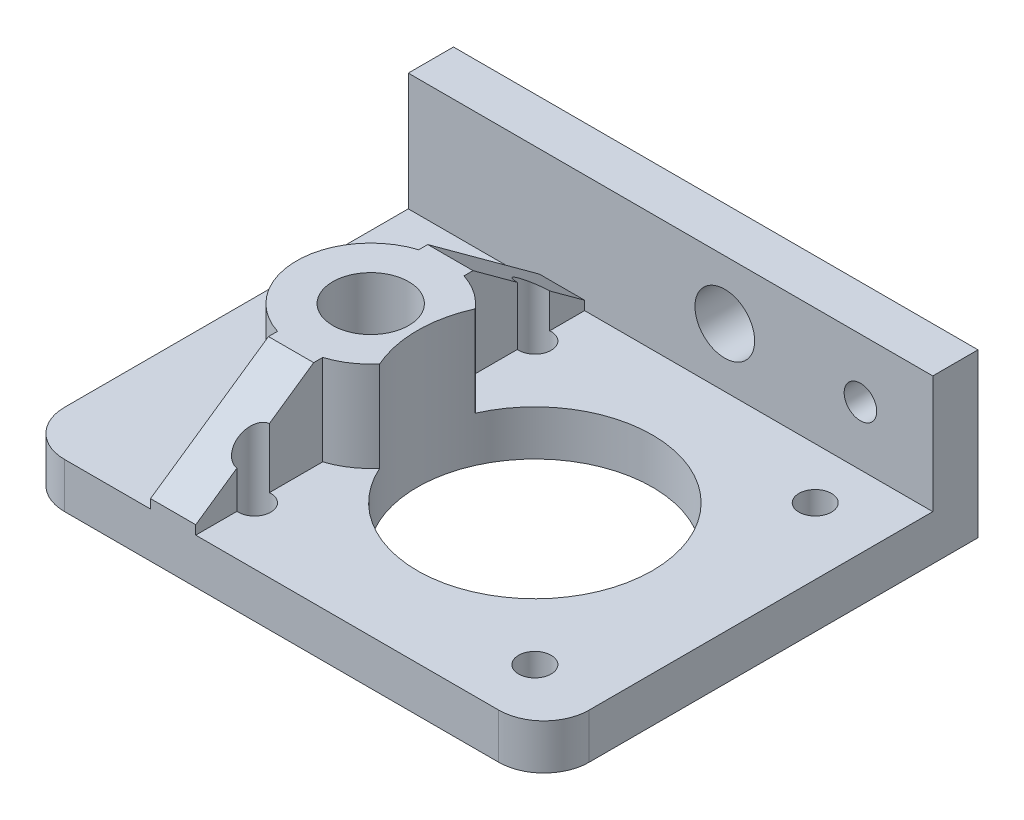
ISO-10303-21;
HEADER;
FILE_DESCRIPTION(('STEP AP214'),'2;1');
FILE_NAME('part.step','',(''),(''),'','','');
FILE_SCHEMA(('AUTOMOTIVE_DESIGN { 1 0 10303 214 1 1 1 1 }'));
ENDSEC;
DATA;
#1=APPLICATION_CONTEXT('core data for automotive mechanical design processes');
#2=APPLICATION_PROTOCOL_DEFINITION('international standard','automotive_design',2000,#1);
#3=PRODUCT_CONTEXT('',#1,'mechanical');
#4=PRODUCT('Part','Part','',(#3));
#5=PRODUCT_RELATED_PRODUCT_CATEGORY('part','',(#4));
#6=PRODUCT_DEFINITION_FORMATION('','',#4);
#7=PRODUCT_DEFINITION_CONTEXT('part definition',#1,'design');
#8=PRODUCT_DEFINITION('design','',#6,#7);
#9=PRODUCT_DEFINITION_SHAPE('','',#8);
#10=(LENGTH_UNIT() NAMED_UNIT(*) SI_UNIT(.MILLI.,.METRE.));
#11=(NAMED_UNIT(*) PLANE_ANGLE_UNIT() SI_UNIT($,.RADIAN.));
#12=(NAMED_UNIT(*) SI_UNIT($,.STERADIAN.) SOLID_ANGLE_UNIT());
#13=UNCERTAINTY_MEASURE_WITH_UNIT(LENGTH_MEASURE(1.E-05),#10,'distance_accuracy_value','');
#14=(GEOMETRIC_REPRESENTATION_CONTEXT(3) GLOBAL_UNCERTAINTY_ASSIGNED_CONTEXT((#13)) GLOBAL_UNIT_ASSIGNED_CONTEXT((#10,
#11,#12)) REPRESENTATION_CONTEXT('',''));
#15=CARTESIAN_POINT('',(0.,0.,0.));
#16=DIRECTION('',(0.,0.,1.));
#17=DIRECTION('',(1.,0.,0.));
#18=AXIS2_PLACEMENT_3D('',#15,#16,#17);
#19=CARTESIAN_POINT('',(0.,5.,0.));
#20=DIRECTION('',(0.,1.,0.));
#21=DIRECTION('',(0.,0.,1.));
#22=AXIS2_PLACEMENT_3D('',#19,#20,#21);
#23=PLANE('',#22);
#24=CARTESIAN_POINT('',(50.65,5.,10.65));
#25=DIRECTION('',(0.,1.,0.));
#26=DIRECTION('',(0.,0.,1.));
#27=AXIS2_PLACEMENT_3D('',#24,#25,#26);
#28=CIRCLE('',#27,1.8);
#29=CARTESIAN_POINT('',(50.65,5.,12.45));
#30=VERTEX_POINT('',#29);
#31=EDGE_CURVE('E335',#30,#30,#28,.T.);
#32=ORIENTED_EDGE('',*,*,#31,.F.);
#33=EDGE_LOOP('',(#32));
#34=FACE_BOUND('',#33,.T.);
#35=CARTESIAN_POINT('',(50.65,5.,41.65));
#36=DIRECTION('',(0.,1.,0.));
#37=DIRECTION('',(0.,0.,1.));
#38=AXIS2_PLACEMENT_3D('',#35,#36,#37);
#39=CIRCLE('',#38,1.8);
#40=CARTESIAN_POINT('',(50.65,5.,43.45));
#41=VERTEX_POINT('',#40);
#42=EDGE_CURVE('E338',#41,#41,#39,.T.);
#43=ORIENTED_EDGE('',*,*,#42,.F.);
#44=EDGE_LOOP('',(#43));
#45=FACE_BOUND('',#44,.T.);
#46=DIRECTION('',(0.,0.,1.));
#47=VECTOR('',#46,1.);
#48=CARTESIAN_POINT('',(58.,5.,0.));
#49=LINE('',#48,#47);
#50=CARTESIAN_POINT('',(58.,5.,5.));
#51=VERTEX_POINT('',#50);
#52=CARTESIAN_POINT('',(58.,5.,43.));
#53=VERTEX_POINT('',#52);
#54=EDGE_CURVE('E351',#51,#53,#49,.T.);
#55=ORIENTED_EDGE('',*,*,#54,.F.);
#56=DIRECTION('',(1.,0.,0.));
#57=VECTOR('',#56,1.);
#58=CARTESIAN_POINT('',(0.,5.,5.));
#59=LINE('',#58,#57);
#60=CARTESIAN_POINT('',(19.5,5.,5.));
#61=VERTEX_POINT('',#60);
#62=EDGE_CURVE('E226',#61,#51,#59,.T.);
#63=ORIENTED_EDGE('',*,*,#62,.F.);
#64=DIRECTION('',(0.,0.,1.));
#65=VECTOR('',#64,1.);
#66=CARTESIAN_POINT('',(19.5,5.,0.));
#67=LINE('',#66,#65);
#68=CARTESIAN_POINT('',(19.5,5.,8.8562608885348));
#69=VERTEX_POINT('',#68);
#70=EDGE_CURVE('E288',#61,#69,#67,.T.);
#71=ORIENTED_EDGE('',*,*,#70,.T.);
#72=CARTESIAN_POINT('',(19.65,5.,10.65));
#73=DIRECTION('',(0.,1.,0.));
#74=DIRECTION('',(0.,0.,1.));
#75=AXIS2_PLACEMENT_3D('',#72,#73,#74);
#76=CIRCLE('',#75,1.8);
#77=CARTESIAN_POINT('',(19.5,5.,12.4437391114652));
#78=VERTEX_POINT('',#77);
#79=EDGE_CURVE('E345',#78,#69,#76,.T.);
#80=ORIENTED_EDGE('',*,*,#79,.F.);
#81=CARTESIAN_POINT('',(19.5,5.,18.3403905347322));
#82=VERTEX_POINT('',#81);
#83=EDGE_CURVE('E285',#78,#82,#67,.T.);
#84=ORIENTED_EDGE('',*,*,#83,.T.);
#85=CARTESIAN_POINT('',(17.,5.,26.15));
#86=DIRECTION('',(0.,1.,0.));
#87=DIRECTION('',(0.,0.,1.));
#88=AXIS2_PLACEMENT_3D('',#85,#86,#87);
#89=CIRCLE('',#88,8.20000000000001);
#90=CARTESIAN_POINT('',(23.271694214876,5.,20.8674010491908));
#91=VERTEX_POINT('',#90);
#92=EDGE_CURVE('E314',#91,#82,#89,.T.);
#93=ORIENTED_EDGE('',*,*,#92,.F.);
#94=CARTESIAN_POINT('',(35.15,5.,26.15));
#95=DIRECTION('',(0.,1.,0.));
#96=DIRECTION('',(0.,0.,1.));
#97=AXIS2_PLACEMENT_3D('',#94,#95,#96);
#98=CIRCLE('',#97,13.);
#99=CARTESIAN_POINT('',(23.271694214876,5.,31.4325989508092));
#100=VERTEX_POINT('',#99);
#101=EDGE_CURVE('E348',#100,#91,#98,.T.);
#102=ORIENTED_EDGE('',*,*,#101,.F.);
#103=CARTESIAN_POINT('',(19.5,5.,33.9596094652678));
#104=VERTEX_POINT('',#103);
#105=EDGE_CURVE('E325',#104,#100,#89,.T.);
#106=ORIENTED_EDGE('',*,*,#105,.F.);
#107=DIRECTION('',(0.,0.,-1.));
#108=VECTOR('',#107,1.);
#109=CARTESIAN_POINT('',(19.5,5.,0.));
#110=LINE('',#109,#108);
#111=CARTESIAN_POINT('',(19.5,5.,39.8562608885348));
#112=VERTEX_POINT('',#111);
#113=EDGE_CURVE('E261',#112,#104,#110,.T.);
#114=ORIENTED_EDGE('',*,*,#113,.F.);
#115=CARTESIAN_POINT('',(19.65,5.,41.65));
#116=DIRECTION('',(0.,1.,0.));
#117=DIRECTION('',(0.,0.,1.));
#118=AXIS2_PLACEMENT_3D('',#115,#116,#117);
#119=CIRCLE('',#118,1.8);
#120=CARTESIAN_POINT('',(19.5,5.,43.4437391114652));
#121=VERTEX_POINT('',#120);
#122=EDGE_CURVE('E342',#121,#112,#119,.T.);
#123=ORIENTED_EDGE('',*,*,#122,.F.);
#124=DIRECTION('',(0.,0.,-1.));
#125=VECTOR('',#124,1.);
#126=CARTESIAN_POINT('',(19.5,5.,0.));
#127=LINE('',#126,#125);
#128=CARTESIAN_POINT('',(19.5,5.,48.));
#129=VERTEX_POINT('',#128);
#130=EDGE_CURVE('E266',#129,#121,#127,.T.);
#131=ORIENTED_EDGE('',*,*,#130,.F.);
#132=DIRECTION('',(1.,0.,0.));
#133=VECTOR('',#132,1.);
#134=CARTESIAN_POINT('',(0.,5.,48.));
#135=LINE('',#134,#133);
#136=CARTESIAN_POINT('',(53.,5.,48.));
#137=VERTEX_POINT('',#136);
#138=EDGE_CURVE('E355',#129,#137,#135,.T.);
#139=ORIENTED_EDGE('',*,*,#138,.T.);
#140=CARTESIAN_POINT('',(53.,5.,43.));
#141=DIRECTION('',(0.,1.,0.));
#142=DIRECTION('',(0.,0.,1.));
#143=AXIS2_PLACEMENT_3D('',#140,#141,#142);
#144=CIRCLE('',#143,5.);
#145=EDGE_CURVE('E396',#137,#53,#144,.T.);
#146=ORIENTED_EDGE('',*,*,#145,.T.);
#147=EDGE_LOOP('',(#55,#63,#71,#80,#84,#93,#102,#106,#114,#123,#131,#139,#146));
#148=FACE_BOUND('',#147,.T.);
#149=ADVANCED_FACE('F37',(#34,#45,#148),#23,.T.);
#150=DIRECTION('',(0.,0.,1.));
#151=VECTOR('',#150,1.);
#152=CARTESIAN_POINT('',(14.5,5.,0.));
#153=LINE('',#152,#151);
#154=CARTESIAN_POINT('',(14.5,5.,5.));
#155=VERTEX_POINT('',#154);
#156=CARTESIAN_POINT('',(14.5,5.,18.3403905347322));
#157=VERTEX_POINT('',#156);
#158=EDGE_CURVE('E289',#155,#157,#153,.T.);
#159=ORIENTED_EDGE('',*,*,#158,.F.);
#160=CARTESIAN_POINT('',(0.,5.,5.));
#161=VERTEX_POINT('',#160);
#162=EDGE_CURVE('E224',#161,#155,#59,.T.);
#163=ORIENTED_EDGE('',*,*,#162,.F.);
#164=DIRECTION('',(0.,0.,1.));
#165=VECTOR('',#164,1.);
#166=CARTESIAN_POINT('',(0.,5.,0.));
#167=LINE('',#166,#165);
#168=CARTESIAN_POINT('',(0.,5.,43.));
#169=VERTEX_POINT('',#168);
#170=EDGE_CURVE('E353',#161,#169,#167,.T.);
#171=ORIENTED_EDGE('',*,*,#170,.T.);
#172=CARTESIAN_POINT('',(5.00000000000001,5.,43.));
#173=DIRECTION('',(0.,1.,0.));
#174=DIRECTION('',(0.,0.,1.));
#175=AXIS2_PLACEMENT_3D('',#172,#173,#174);
#176=CIRCLE('',#175,5.);
#177=CARTESIAN_POINT('',(5.00000000000001,5.,48.));
#178=VERTEX_POINT('',#177);
#179=EDGE_CURVE('E394',#169,#178,#176,.T.);
#180=ORIENTED_EDGE('',*,*,#179,.T.);
#181=CARTESIAN_POINT('',(14.5,5.,48.));
#182=VERTEX_POINT('',#181);
#183=EDGE_CURVE('E209',#178,#182,#135,.T.);
#184=ORIENTED_EDGE('',*,*,#183,.T.);
#185=DIRECTION('',(0.,0.,-1.));
#186=VECTOR('',#185,1.);
#187=CARTESIAN_POINT('',(14.5,5.,0.));
#188=LINE('',#187,#186);
#189=CARTESIAN_POINT('',(14.5,5.,33.9596094652678));
#190=VERTEX_POINT('',#189);
#191=EDGE_CURVE('E269',#182,#190,#188,.T.);
#192=ORIENTED_EDGE('',*,*,#191,.T.);
#193=EDGE_CURVE('E328',#157,#190,#89,.T.);
#194=ORIENTED_EDGE('',*,*,#193,.F.);
#195=EDGE_LOOP('',(#159,#163,#171,#180,#184,#192,#194));
#196=FACE_BOUND('',#195,.T.);
#197=ADVANCED_FACE('F483',(#196),#23,.T.);
#198=CARTESIAN_POINT('',(17.,15.,26.15));
#199=DIRECTION('',(0.,-1.,0.));
#200=DIRECTION('',(0.,0.,-1.));
#201=AXIS2_PLACEMENT_3D('',#198,#199,#200);
#202=CYLINDRICAL_SURFACE('',#201,8.20000000000001);
#203=DIRECTION('',(0.,-1.,0.));
#204=VECTOR('',#203,1.);
#205=CARTESIAN_POINT('',(19.5,15.,33.9596094652678));
#206=LINE('',#205,#204);
#207=CARTESIAN_POINT('',(19.5,15.,33.9596094652678));
#208=VERTEX_POINT('',#207);
#209=EDGE_CURVE('E281',#104,#208,#206,.F.);
#210=ORIENTED_EDGE('',*,*,#209,.F.);
#211=ORIENTED_EDGE('',*,*,#105,.T.);
#212=DIRECTION('',(0.,-1.,0.));
#213=VECTOR('',#212,1.);
#214=CARTESIAN_POINT('',(23.271694214876,15.,31.4325989508092));
#215=LINE('',#214,#213);
#216=CARTESIAN_POINT('',(23.271694214876,15.,31.4325989508092));
#217=VERTEX_POINT('',#216);
#218=EDGE_CURVE('E321',#217,#100,#215,.T.);
#219=ORIENTED_EDGE('',*,*,#218,.F.);
#220=CARTESIAN_POINT('',(17.,15.,26.15));
#221=DIRECTION('',(0.,1.,0.));
#222=DIRECTION('',(0.,0.,1.));
#223=AXIS2_PLACEMENT_3D('',#220,#221,#222);
#224=CIRCLE('',#223,8.20000000000001);
#225=EDGE_CURVE('E317',#208,#217,#224,.T.);
#226=ORIENTED_EDGE('',*,*,#225,.F.);
#227=EDGE_LOOP('',(#210,#211,#219,#226));
#228=FACE_BOUND('',#227,.T.);
#229=ADVANCED_FACE('F431',(#228),#202,.T.);
#230=ORIENTED_EDGE('',*,*,#193,.T.);
#231=DIRECTION('',(0.,-1.,0.));
#232=VECTOR('',#231,1.);
#233=CARTESIAN_POINT('',(14.5,15.,33.9596094652678));
#234=LINE('',#233,#232);
#235=CARTESIAN_POINT('',(14.5,15.,33.9596094652678));
#236=VERTEX_POINT('',#235);
#237=EDGE_CURVE('E273',#190,#236,#234,.F.);
#238=ORIENTED_EDGE('',*,*,#237,.T.);
#239=CARTESIAN_POINT('',(14.5,15.,18.3403905347322));
#240=VERTEX_POINT('',#239);
#241=EDGE_CURVE('E322',#240,#236,#224,.T.);
#242=ORIENTED_EDGE('',*,*,#241,.F.);
#243=DIRECTION('',(0.,-1.,0.));
#244=VECTOR('',#243,1.);
#245=CARTESIAN_POINT('',(14.5,15.,18.3403905347322));
#246=LINE('',#245,#244);
#247=EDGE_CURVE('E303',#157,#240,#246,.F.);
#248=ORIENTED_EDGE('',*,*,#247,.F.);
#249=EDGE_LOOP('',(#230,#238,#242,#248));
#250=FACE_BOUND('',#249,.T.);
#251=ADVANCED_FACE('F422',(#250),#202,.T.);
#252=CARTESIAN_POINT('',(58.,5.,0.));
#253=DIRECTION('',(1.,0.,0.));
#254=DIRECTION('',(0.,0.,-1.));
#255=AXIS2_PLACEMENT_3D('',#252,#253,#254);
#256=PLANE('',#255);
#257=DIRECTION('',(0.,-1.,0.));
#258=VECTOR('',#257,1.);
#259=CARTESIAN_POINT('',(58.,5.,0.));
#260=LINE('',#259,#258);
#261=CARTESIAN_POINT('',(58.,18.,0.));
#262=VERTEX_POINT('',#261);
#263=CARTESIAN_POINT('',(58.,0.,0.));
#264=VERTEX_POINT('',#263);
#265=EDGE_CURVE('E208',#262,#264,#260,.T.);
#266=ORIENTED_EDGE('',*,*,#265,.F.);
#267=DIRECTION('',(0.,0.,-1.));
#268=VECTOR('',#267,1.);
#269=CARTESIAN_POINT('',(58.,18.,0.));
#270=LINE('',#269,#268);
#271=CARTESIAN_POINT('',(58.,18.,5.));
#272=VERTEX_POINT('',#271);
#273=EDGE_CURVE('E223',#272,#262,#270,.T.);
#274=ORIENTED_EDGE('',*,*,#273,.F.);
#275=DIRECTION('',(0.,-1.,0.));
#276=VECTOR('',#275,1.);
#277=CARTESIAN_POINT('',(58.,18.,5.));
#278=LINE('',#277,#276);
#279=EDGE_CURVE('E233',#272,#51,#278,.T.);
#280=ORIENTED_EDGE('',*,*,#279,.T.);
#281=ORIENTED_EDGE('',*,*,#54,.T.);
#282=DIRECTION('',(0.,-1.,0.));
#283=VECTOR('',#282,1.);
#284=CARTESIAN_POINT('',(58.,0.,43.));
#285=LINE('',#284,#283);
#286=CARTESIAN_POINT('',(58.,0.,43.));
#287=VERTEX_POINT('',#286);
#288=EDGE_CURVE('E381',#53,#287,#285,.T.);
#289=ORIENTED_EDGE('',*,*,#288,.T.);
#290=DIRECTION('',(0.,0.,1.));
#291=VECTOR('',#290,1.);
#292=CARTESIAN_POINT('',(58.,0.,0.));
#293=LINE('',#292,#291);
#294=EDGE_CURVE('E372',#264,#287,#293,.T.);
#295=ORIENTED_EDGE('',*,*,#294,.F.);
#296=EDGE_LOOP('',(#266,#274,#280,#281,#289,#295));
#297=FACE_BOUND('',#296,.T.);
#298=ADVANCED_FACE('F516',(#297),#256,.T.);
#299=CARTESIAN_POINT('',(0.,5.,0.));
#300=DIRECTION('',(0.,0.,-1.));
#301=DIRECTION('',(-1.,0.,0.));
#302=AXIS2_PLACEMENT_3D('',#299,#300,#301);
#303=PLANE('',#302);
#304=CARTESIAN_POINT('',(35.,11.5,0.));
#305=DIRECTION('',(0.,0.,-1.));
#306=DIRECTION('',(-1.,0.,0.));
#307=AXIS2_PLACEMENT_3D('',#304,#305,#306);
#308=CIRCLE('',#307,3.3);
#309=CARTESIAN_POINT('',(31.7,11.5,0.));
#310=VERTEX_POINT('',#309);
#311=EDGE_CURVE('E464',#310,#310,#308,.T.);
#312=ORIENTED_EDGE('',*,*,#311,.F.);
#313=EDGE_LOOP('',(#312));
#314=FACE_BOUND('',#313,.T.);
#315=CARTESIAN_POINT('',(50.,11.5,0.));
#316=DIRECTION('',(0.,0.,-1.));
#317=DIRECTION('',(-1.,0.,0.));
#318=AXIS2_PLACEMENT_3D('',#315,#316,#317);
#319=CIRCLE('',#318,1.79999999999999);
#320=CARTESIAN_POINT('',(48.2,11.5,0.));
#321=VERTEX_POINT('',#320);
#322=EDGE_CURVE('E229',#321,#321,#319,.T.);
#323=ORIENTED_EDGE('',*,*,#322,.F.);
#324=EDGE_LOOP('',(#323));
#325=FACE_BOUND('',#324,.T.);
#326=DIRECTION('',(1.,0.,0.));
#327=VECTOR('',#326,1.);
#328=CARTESIAN_POINT('',(0.,0.,0.));
#329=LINE('',#328,#327);
#330=CARTESIAN_POINT('',(0.,0.,0.));
#331=VERTEX_POINT('',#330);
#332=EDGE_CURVE('E204',#331,#264,#329,.T.);
#333=ORIENTED_EDGE('',*,*,#332,.F.);
#334=DIRECTION('',(0.,-1.,0.));
#335=VECTOR('',#334,1.);
#336=CARTESIAN_POINT('',(0.,5.,0.));
#337=LINE('',#336,#335);
#338=CARTESIAN_POINT('',(0.,18.,0.));
#339=VERTEX_POINT('',#338);
#340=EDGE_CURVE('E198',#339,#331,#337,.T.);
#341=ORIENTED_EDGE('',*,*,#340,.F.);
#342=DIRECTION('',(-1.,0.,0.));
#343=VECTOR('',#342,1.);
#344=CARTESIAN_POINT('',(0.,18.,0.));
#345=LINE('',#344,#343);
#346=EDGE_CURVE('E202',#262,#339,#345,.T.);
#347=ORIENTED_EDGE('',*,*,#346,.F.);
#348=ORIENTED_EDGE('',*,*,#265,.T.);
#349=EDGE_LOOP('',(#333,#341,#347,#348));
#350=FACE_BOUND('',#349,.T.);
#351=ADVANCED_FACE('F200',(#314,#325,#350),#303,.T.);
#352=CARTESIAN_POINT('',(0.,5.,0.));
#353=DIRECTION('',(1.,0.,0.));
#354=DIRECTION('',(0.,0.,-1.));
#355=AXIS2_PLACEMENT_3D('',#352,#353,#354);
#356=PLANE('',#355);
#357=DIRECTION('',(0.,0.,1.));
#358=VECTOR('',#357,1.);
#359=CARTESIAN_POINT('',(0.,0.,0.));
#360=LINE('',#359,#358);
#361=CARTESIAN_POINT('',(0.,0.,43.));
#362=VERTEX_POINT('',#361);
#363=EDGE_CURVE('E376',#331,#362,#360,.T.);
#364=ORIENTED_EDGE('',*,*,#363,.T.);
#365=DIRECTION('',(0.,-1.,0.));
#366=VECTOR('',#365,1.);
#367=CARTESIAN_POINT('',(0.,5.,43.));
#368=LINE('',#367,#366);
#369=EDGE_CURVE('E399',#362,#169,#368,.F.);
#370=ORIENTED_EDGE('',*,*,#369,.T.);
#371=ORIENTED_EDGE('',*,*,#170,.F.);
#372=DIRECTION('',(0.,-1.,0.));
#373=VECTOR('',#372,1.);
#374=CARTESIAN_POINT('',(0.,18.,5.));
#375=LINE('',#374,#373);
#376=CARTESIAN_POINT('',(0.,18.,5.));
#377=VERTEX_POINT('',#376);
#378=EDGE_CURVE('E215',#377,#161,#375,.T.);
#379=ORIENTED_EDGE('',*,*,#378,.F.);
#380=DIRECTION('',(0.,0.,1.));
#381=VECTOR('',#380,1.);
#382=CARTESIAN_POINT('',(0.,18.,0.));
#383=LINE('',#382,#381);
#384=EDGE_CURVE('E212',#339,#377,#383,.T.);
#385=ORIENTED_EDGE('',*,*,#384,.F.);
#386=ORIENTED_EDGE('',*,*,#340,.T.);
#387=EDGE_LOOP('',(#364,#370,#371,#379,#385,#386));
#388=FACE_BOUND('',#387,.T.);
#389=ADVANCED_FACE('F213',(#388),#356,.F.);
#390=CARTESIAN_POINT('',(35.15,5.,26.15));
#391=DIRECTION('',(0.,-1.,0.));
#392=DIRECTION('',(0.,0.,-1.));
#393=AXIS2_PLACEMENT_3D('',#390,#391,#392);
#394=CYLINDRICAL_SURFACE('',#393,13.);
#395=ORIENTED_EDGE('',*,*,#101,.T.);
#396=DIRECTION('',(0.,-1.,0.));
#397=VECTOR('',#396,1.);
#398=CARTESIAN_POINT('',(23.271694214876,15.,20.8674010491908));
#399=LINE('',#398,#397);
#400=CARTESIAN_POINT('',(23.271694214876,15.,20.8674010491908));
#401=VERTEX_POINT('',#400);
#402=EDGE_CURVE('E331',#401,#91,#399,.T.);
#403=ORIENTED_EDGE('',*,*,#402,.F.);
#404=CARTESIAN_POINT('',(35.15,15.,26.15));
#405=DIRECTION('',(0.,1.,0.));
#406=DIRECTION('',(0.,0.,1.));
#407=AXIS2_PLACEMENT_3D('',#404,#405,#406);
#408=CIRCLE('',#407,13.);
#409=EDGE_CURVE('E313',#217,#401,#408,.F.);
#410=ORIENTED_EDGE('',*,*,#409,.F.);
#411=ORIENTED_EDGE('',*,*,#218,.T.);
#412=EDGE_LOOP('',(#395,#403,#410,#411));
#413=FACE_BOUND('',#412,.T.);
#414=CARTESIAN_POINT('',(35.15,0.,26.15));
#415=DIRECTION('',(0.,1.,0.));
#416=DIRECTION('',(0.,0.,1.));
#417=AXIS2_PLACEMENT_3D('',#414,#415,#416);
#418=CIRCLE('',#417,13.);
#419=CARTESIAN_POINT('',(35.15,0.,39.15));
#420=VERTEX_POINT('',#419);
#421=EDGE_CURVE('E369',#420,#420,#418,.T.);
#422=ORIENTED_EDGE('',*,*,#421,.F.);
#423=EDGE_LOOP('',(#422));
#424=FACE_BOUND('',#423,.T.);
#425=ADVANCED_FACE('F435',(#413,#424),#394,.F.);
#426=CARTESIAN_POINT('',(19.65,5.,10.65));
#427=DIRECTION('',(0.,-1.,0.));
#428=DIRECTION('',(0.,0.,-1.));
#429=AXIS2_PLACEMENT_3D('',#426,#427,#428);
#430=CYLINDRICAL_SURFACE('',#429,1.8);
#431=CARTESIAN_POINT('',(19.65,10.1206151342522,10.65));
#432=DIRECTION('',(0.,-0.807951468125277,0.58924903492005));
#433=DIRECTION('',(0.,-0.58924903492005,-0.807951468125277));
#434=AXIS2_PLACEMENT_3D('',#431,#432,#433);
#435=ELLIPSE('',#434,2.22785658670392,1.8);
#436=CARTESIAN_POINT('',(19.5,11.428811334182,12.4437391114652));
#437=VERTEX_POINT('',#436);
#438=CARTESIAN_POINT('',(19.5,8.81241893432235,8.8562608885348));
#439=VERTEX_POINT('',#438);
#440=EDGE_CURVE('E256',#437,#439,#435,.T.);
#441=ORIENTED_EDGE('',*,*,#440,.F.);
#442=DIRECTION('',(0.,-1.,0.));
#443=VECTOR('',#442,1.);
#444=CARTESIAN_POINT('',(19.5,31.6199428398536,12.4437391114652));
#445=LINE('',#444,#443);
#446=EDGE_CURVE('E297',#437,#78,#445,.T.);
#447=ORIENTED_EDGE('',*,*,#446,.T.);
#448=ORIENTED_EDGE('',*,*,#79,.T.);
#449=DIRECTION('',(0.,-1.,0.));
#450=VECTOR('',#449,1.);
#451=CARTESIAN_POINT('',(19.5,31.6199428398536,8.8562608885348));
#452=LINE('',#451,#450);
#453=EDGE_CURVE('E287',#439,#69,#452,.T.);
#454=ORIENTED_EDGE('',*,*,#453,.F.);
#455=EDGE_LOOP('',(#441,#447,#448,#454));
#456=FACE_BOUND('',#455,.T.);
#457=CARTESIAN_POINT('',(19.65,0.,10.65));
#458=DIRECTION('',(0.,1.,0.));
#459=DIRECTION('',(0.,0.,1.));
#460=AXIS2_PLACEMENT_3D('',#457,#458,#459);
#461=CIRCLE('',#460,1.8);
#462=CARTESIAN_POINT('',(19.65,0.,12.45));
#463=VERTEX_POINT('',#462);
#464=EDGE_CURVE('E366',#463,#463,#461,.T.);
#465=ORIENTED_EDGE('',*,*,#464,.F.);
#466=EDGE_LOOP('',(#465));
#467=FACE_BOUND('',#466,.T.);
#468=ADVANCED_FACE('F448',(#456,#467),#430,.F.);
#469=CARTESIAN_POINT('',(19.65,5.,41.65));
#470=DIRECTION('',(0.,-1.,0.));
#471=DIRECTION('',(0.,0.,-1.));
#472=AXIS2_PLACEMENT_3D('',#469,#470,#471);
#473=CYLINDRICAL_SURFACE('',#472,1.8);
#474=CARTESIAN_POINT('',(19.65,10.3825374591186,41.65));
#475=DIRECTION('',(0.,-0.823017255566813,-0.568016370397255));
#476=DIRECTION('',(0.,-0.568016370397255,0.823017255566813));
#477=AXIS2_PLACEMENT_3D('',#474,#475,#476);
#478=ELLIPSE('',#477,2.18707443595498,1.8);
#479=CARTESIAN_POINT('',(19.5,9.14456441220801,43.4437391114652));
#480=VERTEX_POINT('',#479);
#481=CARTESIAN_POINT('',(19.5,11.6205105060292,39.8562608885348));
#482=VERTEX_POINT('',#481);
#483=EDGE_CURVE('E242',#480,#482,#478,.T.);
#484=ORIENTED_EDGE('',*,*,#483,.F.);
#485=DIRECTION('',(0.,-1.,0.));
#486=VECTOR('',#485,1.);
#487=CARTESIAN_POINT('',(19.5,31.6199428398536,43.4437391114652));
#488=LINE('',#487,#486);
#489=EDGE_CURVE('E264',#480,#121,#488,.T.);
#490=ORIENTED_EDGE('',*,*,#489,.T.);
#491=ORIENTED_EDGE('',*,*,#122,.T.);
#492=DIRECTION('',(0.,-1.,0.));
#493=VECTOR('',#492,1.);
#494=CARTESIAN_POINT('',(19.5,31.6199428398536,39.8562608885348));
#495=LINE('',#494,#493);
#496=EDGE_CURVE('E265',#482,#112,#495,.T.);
#497=ORIENTED_EDGE('',*,*,#496,.F.);
#498=EDGE_LOOP('',(#484,#490,#491,#497));
#499=FACE_BOUND('',#498,.T.);
#500=CARTESIAN_POINT('',(19.65,0.,41.65));
#501=DIRECTION('',(0.,1.,0.));
#502=DIRECTION('',(0.,0.,1.));
#503=AXIS2_PLACEMENT_3D('',#500,#501,#502);
#504=CIRCLE('',#503,1.8);
#505=CARTESIAN_POINT('',(19.65,0.,43.45));
#506=VERTEX_POINT('',#505);
#507=EDGE_CURVE('E363',#506,#506,#504,.T.);
#508=ORIENTED_EDGE('',*,*,#507,.F.);
#509=EDGE_LOOP('',(#508));
#510=FACE_BOUND('',#509,.T.);
#511=ADVANCED_FACE('F504',(#499,#510),#473,.F.);
#512=CARTESIAN_POINT('',(50.65,5.,41.65));
#513=DIRECTION('',(0.,-1.,0.));
#514=DIRECTION('',(0.,0.,-1.));
#515=AXIS2_PLACEMENT_3D('',#512,#513,#514);
#516=CYLINDRICAL_SURFACE('',#515,1.8);
#517=ORIENTED_EDGE('',*,*,#42,.T.);
#518=EDGE_LOOP('',(#517));
#519=FACE_BOUND('',#518,.T.);
#520=CARTESIAN_POINT('',(50.65,0.,41.65));
#521=DIRECTION('',(0.,1.,0.));
#522=DIRECTION('',(0.,0.,1.));
#523=AXIS2_PLACEMENT_3D('',#520,#521,#522);
#524=CIRCLE('',#523,1.8);
#525=CARTESIAN_POINT('',(50.65,0.,43.45));
#526=VERTEX_POINT('',#525);
#527=EDGE_CURVE('E360',#526,#526,#524,.T.);
#528=ORIENTED_EDGE('',*,*,#527,.F.);
#529=EDGE_LOOP('',(#528));
#530=FACE_BOUND('',#529,.T.);
#531=ADVANCED_FACE('F596',(#519,#530),#516,.F.);
#532=CARTESIAN_POINT('',(50.65,5.,10.65));
#533=DIRECTION('',(0.,-1.,0.));
#534=DIRECTION('',(0.,0.,-1.));
#535=AXIS2_PLACEMENT_3D('',#532,#533,#534);
#536=CYLINDRICAL_SURFACE('',#535,1.8);
#537=ORIENTED_EDGE('',*,*,#31,.T.);
#538=EDGE_LOOP('',(#537));
#539=FACE_BOUND('',#538,.T.);
#540=CARTESIAN_POINT('',(50.65,0.,10.65));
#541=DIRECTION('',(0.,1.,0.));
#542=DIRECTION('',(0.,0.,1.));
#543=AXIS2_PLACEMENT_3D('',#540,#541,#542);
#544=CIRCLE('',#543,1.8);
#545=CARTESIAN_POINT('',(50.65,0.,12.45));
#546=VERTEX_POINT('',#545);
#547=EDGE_CURVE('E334',#546,#546,#544,.T.);
#548=ORIENTED_EDGE('',*,*,#547,.F.);
#549=EDGE_LOOP('',(#548));
#550=FACE_BOUND('',#549,.T.);
#551=ADVANCED_FACE('F529',(#539,#550),#536,.F.);
#552=CARTESIAN_POINT('',(0.,5.,48.));
#553=DIRECTION('',(0.,0.,-1.));
#554=DIRECTION('',(-1.,0.,0.));
#555=AXIS2_PLACEMENT_3D('',#552,#553,#554);
#556=PLANE('',#555);
#557=DIRECTION('',(0.,-1.,0.));
#558=VECTOR('',#557,1.);
#559=CARTESIAN_POINT('',(19.5,31.6199428398536,48.));
#560=LINE('',#559,#558);
#561=CARTESIAN_POINT('',(19.5,6.,48.));
#562=VERTEX_POINT('',#561);
#563=EDGE_CURVE('E58',#562,#129,#560,.T.);
#564=ORIENTED_EDGE('',*,*,#563,.F.);
#565=DIRECTION('',(-1.,0.,0.));
#566=VECTOR('',#565,1.);
#567=CARTESIAN_POINT('',(58.,6.,48.));
#568=LINE('',#567,#566);
#569=CARTESIAN_POINT('',(14.5,6.,48.));
#570=VERTEX_POINT('',#569);
#571=EDGE_CURVE('E52',#562,#570,#568,.T.);
#572=ORIENTED_EDGE('',*,*,#571,.T.);
#573=DIRECTION('',(0.,-1.,0.));
#574=VECTOR('',#573,1.);
#575=CARTESIAN_POINT('',(14.5,31.6199428398536,48.));
#576=LINE('',#575,#574);
#577=EDGE_CURVE('E268',#570,#182,#576,.T.);
#578=ORIENTED_EDGE('',*,*,#577,.T.);
#579=ORIENTED_EDGE('',*,*,#183,.F.);
#580=DIRECTION('',(0.,-1.,0.));
#581=VECTOR('',#580,1.);
#582=CARTESIAN_POINT('',(5.00000000000001,5.,48.));
#583=LINE('',#582,#581);
#584=CARTESIAN_POINT('',(5.00000000000001,0.,48.));
#585=VERTEX_POINT('',#584);
#586=EDGE_CURVE('E388',#178,#585,#583,.T.);
#587=ORIENTED_EDGE('',*,*,#586,.T.);
#588=DIRECTION('',(1.,0.,0.));
#589=VECTOR('',#588,1.);
#590=CARTESIAN_POINT('',(0.,0.,48.));
#591=LINE('',#590,#589);
#592=CARTESIAN_POINT('',(53.,0.,48.));
#593=VERTEX_POINT('',#592);
#594=EDGE_CURVE('E339',#585,#593,#591,.T.);
#595=ORIENTED_EDGE('',*,*,#594,.T.);
#596=DIRECTION('',(0.,-1.,0.));
#597=VECTOR('',#596,1.);
#598=CARTESIAN_POINT('',(53.,5.,48.));
#599=LINE('',#598,#597);
#600=EDGE_CURVE('E391',#593,#137,#599,.F.);
#601=ORIENTED_EDGE('',*,*,#600,.T.);
#602=ORIENTED_EDGE('',*,*,#138,.F.);
#603=EDGE_LOOP('',(#564,#572,#578,#579,#587,#595,#601,#602));
#604=FACE_BOUND('',#603,.T.);
#605=ADVANCED_FACE('F491',(#604),#556,.F.);
#606=CARTESIAN_POINT('',(0.,0.,0.));
#607=DIRECTION('',(0.,1.,0.));
#608=DIRECTION('',(0.,0.,1.));
#609=AXIS2_PLACEMENT_3D('',#606,#607,#608);
#610=PLANE('',#609);
#611=ORIENTED_EDGE('',*,*,#547,.T.);
#612=EDGE_LOOP('',(#611));
#613=FACE_BOUND('',#612,.T.);
#614=ORIENTED_EDGE('',*,*,#527,.T.);
#615=EDGE_LOOP('',(#614));
#616=FACE_BOUND('',#615,.T.);
#617=ORIENTED_EDGE('',*,*,#507,.T.);
#618=EDGE_LOOP('',(#617));
#619=FACE_BOUND('',#618,.T.);
#620=ORIENTED_EDGE('',*,*,#464,.T.);
#621=EDGE_LOOP('',(#620));
#622=FACE_BOUND('',#621,.T.);
#623=ORIENTED_EDGE('',*,*,#421,.T.);
#624=EDGE_LOOP('',(#623));
#625=FACE_BOUND('',#624,.T.);
#626=ORIENTED_EDGE('',*,*,#294,.T.);
#627=CARTESIAN_POINT('',(53.,0.,43.));
#628=DIRECTION('',(0.,1.,0.));
#629=DIRECTION('',(0.,0.,1.));
#630=AXIS2_PLACEMENT_3D('',#627,#628,#629);
#631=CIRCLE('',#630,5.);
#632=EDGE_CURVE('E386',#287,#593,#631,.F.);
#633=ORIENTED_EDGE('',*,*,#632,.T.);
#634=ORIENTED_EDGE('',*,*,#594,.F.);
#635=CARTESIAN_POINT('',(5.00000000000001,0.,43.));
#636=DIRECTION('',(0.,1.,0.));
#637=DIRECTION('',(0.,0.,1.));
#638=AXIS2_PLACEMENT_3D('',#635,#636,#637);
#639=CIRCLE('',#638,5.);
#640=EDGE_CURVE('E384',#585,#362,#639,.F.);
#641=ORIENTED_EDGE('',*,*,#640,.T.);
#642=ORIENTED_EDGE('',*,*,#363,.F.);
#643=ORIENTED_EDGE('',*,*,#332,.T.);
#644=EDGE_LOOP('',(#626,#633,#634,#641,#642,#643));
#645=FACE_BOUND('',#644,.T.);
#646=ADVANCED_FACE('F518',(#613,#616,#619,#622,#625,#645),#610,.F.);
#647=CARTESIAN_POINT('',(17.,15.,26.15));
#648=DIRECTION('',(0.,-1.,0.));
#649=DIRECTION('',(0.,0.,-1.));
#650=AXIS2_PLACEMENT_3D('',#647,#648,#649);
#651=CYLINDRICAL_SURFACE('',#650,4.19999999999999);
#652=CARTESIAN_POINT('',(17.,15.,26.15));
#653=DIRECTION('',(0.,1.,0.));
#654=DIRECTION('',(0.,0.,1.));
#655=AXIS2_PLACEMENT_3D('',#652,#653,#654);
#656=CIRCLE('',#655,4.19999999999999);
#657=CARTESIAN_POINT('',(17.,15.,30.35));
#658=VERTEX_POINT('',#657);
#659=EDGE_CURVE('E310',#658,#658,#656,.T.);
#660=ORIENTED_EDGE('',*,*,#659,.T.);
#661=EDGE_LOOP('',(#660));
#662=FACE_BOUND('',#661,.T.);
#663=CARTESIAN_POINT('',(17.,5.,26.15));
#664=DIRECTION('',(0.,1.,0.));
#665=DIRECTION('',(0.,0.,1.));
#666=AXIS2_PLACEMENT_3D('',#663,#664,#665);
#667=CIRCLE('',#666,4.19999999999999);
#668=CARTESIAN_POINT('',(17.,5.,30.35));
#669=VERTEX_POINT('',#668);
#670=EDGE_CURVE('E309',#669,#669,#667,.T.);
#671=ORIENTED_EDGE('',*,*,#670,.F.);
#672=EDGE_LOOP('',(#671));
#673=FACE_BOUND('',#672,.T.);
#674=ADVANCED_FACE('F520',(#662,#673),#651,.F.);
#675=ORIENTED_EDGE('',*,*,#92,.T.);
#676=DIRECTION('',(0.,-1.,0.));
#677=VECTOR('',#676,1.);
#678=CARTESIAN_POINT('',(19.5,15.,18.3403905347322));
#679=LINE('',#678,#677);
#680=CARTESIAN_POINT('',(19.5,15.,18.3403905347322));
#681=VERTEX_POINT('',#680);
#682=EDGE_CURVE('E306',#82,#681,#679,.F.);
#683=ORIENTED_EDGE('',*,*,#682,.T.);
#684=EDGE_CURVE('E318',#401,#681,#224,.T.);
#685=ORIENTED_EDGE('',*,*,#684,.F.);
#686=ORIENTED_EDGE('',*,*,#402,.T.);
#687=EDGE_LOOP('',(#675,#683,#685,#686));
#688=FACE_BOUND('',#687,.T.);
#689=ADVANCED_FACE('F438',(#688),#202,.T.);
#690=CARTESIAN_POINT('',(0.,15.,0.));
#691=DIRECTION('',(0.,1.,0.));
#692=DIRECTION('',(0.,0.,1.));
#693=AXIS2_PLACEMENT_3D('',#690,#691,#692);
#694=PLANE('',#693);
#695=DIRECTION('',(-1.,0.,0.));
#696=VECTOR('',#695,1.);
#697=CARTESIAN_POINT('',(58.,15.,34.9596094652678));
#698=LINE('',#697,#696);
#699=CARTESIAN_POINT('',(19.5,15.,34.9596094652678));
#700=VERTEX_POINT('',#699);
#701=CARTESIAN_POINT('',(14.5,15.,34.9596094652678));
#702=VERTEX_POINT('',#701);
#703=EDGE_CURVE('E240',#700,#702,#698,.T.);
#704=ORIENTED_EDGE('',*,*,#703,.F.);
#705=DIRECTION('',(0.,0.,-1.));
#706=VECTOR('',#705,1.);
#707=CARTESIAN_POINT('',(19.5,15.,0.));
#708=LINE('',#707,#706);
#709=EDGE_CURVE('E260',#700,#208,#708,.T.);
#710=ORIENTED_EDGE('',*,*,#709,.T.);
#711=ORIENTED_EDGE('',*,*,#225,.T.);
#712=ORIENTED_EDGE('',*,*,#409,.T.);
#713=ORIENTED_EDGE('',*,*,#684,.T.);
#714=DIRECTION('',(0.,0.,1.));
#715=VECTOR('',#714,1.);
#716=CARTESIAN_POINT('',(19.5,15.,0.));
#717=LINE('',#716,#715);
#718=CARTESIAN_POINT('',(19.5,15.,17.3403905347322));
#719=VERTEX_POINT('',#718);
#720=EDGE_CURVE('E295',#719,#681,#717,.T.);
#721=ORIENTED_EDGE('',*,*,#720,.F.);
#722=DIRECTION('',(-1.,0.,0.));
#723=VECTOR('',#722,1.);
#724=CARTESIAN_POINT('',(58.,15.,17.3403905347322));
#725=LINE('',#724,#723);
#726=CARTESIAN_POINT('',(14.5,15.,17.3403905347322));
#727=VERTEX_POINT('',#726);
#728=EDGE_CURVE('E250',#719,#727,#725,.T.);
#729=ORIENTED_EDGE('',*,*,#728,.T.);
#730=DIRECTION('',(0.,0.,1.));
#731=VECTOR('',#730,1.);
#732=CARTESIAN_POINT('',(14.5,15.,0.));
#733=LINE('',#732,#731);
#734=EDGE_CURVE('E284',#727,#240,#733,.T.);
#735=ORIENTED_EDGE('',*,*,#734,.T.);
#736=ORIENTED_EDGE('',*,*,#241,.T.);
#737=DIRECTION('',(0.,0.,-1.));
#738=VECTOR('',#737,1.);
#739=CARTESIAN_POINT('',(14.5,15.,0.));
#740=LINE('',#739,#738);
#741=EDGE_CURVE('E271',#702,#236,#740,.T.);
#742=ORIENTED_EDGE('',*,*,#741,.F.);
#743=EDGE_LOOP('',(#704,#710,#711,#712,#713,#721,#729,#735,#736,#742));
#744=FACE_BOUND('',#743,.T.);
#745=ORIENTED_EDGE('',*,*,#659,.F.);
#746=EDGE_LOOP('',(#745));
#747=FACE_BOUND('',#746,.T.);
#748=ADVANCED_FACE('F416',(#744,#747),#694,.T.);
#749=ORIENTED_EDGE('',*,*,#670,.T.);
#750=EDGE_LOOP('',(#749));
#751=FACE_BOUND('',#750,.T.);
#752=ADVANCED_FACE('F535',(#751),#23,.T.);
#753=CARTESIAN_POINT('',(53.,5.,43.));
#754=DIRECTION('',(0.,1.,0.));
#755=DIRECTION('',(0.,0.,1.));
#756=AXIS2_PLACEMENT_3D('',#753,#754,#755);
#757=CYLINDRICAL_SURFACE('',#756,5.);
#758=ORIENTED_EDGE('',*,*,#145,.F.);
#759=ORIENTED_EDGE('',*,*,#600,.F.);
#760=ORIENTED_EDGE('',*,*,#632,.F.);
#761=ORIENTED_EDGE('',*,*,#288,.F.);
#762=EDGE_LOOP('',(#758,#759,#760,#761));
#763=FACE_BOUND('',#762,.T.);
#764=ADVANCED_FACE('F513',(#763),#757,.T.);
#765=CARTESIAN_POINT('',(5.00000000000001,5.,43.));
#766=DIRECTION('',(0.,-1.,0.));
#767=DIRECTION('',(0.,0.,-1.));
#768=AXIS2_PLACEMENT_3D('',#765,#766,#767);
#769=CYLINDRICAL_SURFACE('',#768,5.);
#770=ORIENTED_EDGE('',*,*,#179,.F.);
#771=ORIENTED_EDGE('',*,*,#369,.F.);
#772=ORIENTED_EDGE('',*,*,#640,.F.);
#773=ORIENTED_EDGE('',*,*,#586,.F.);
#774=EDGE_LOOP('',(#770,#771,#772,#773));
#775=FACE_BOUND('',#774,.T.);
#776=ADVANCED_FACE('F39',(#775),#769,.T.);
#777=CARTESIAN_POINT('',(19.5,31.6199428398536,0.));
#778=DIRECTION('',(1.,0.,0.));
#779=DIRECTION('',(0.,0.,-1.));
#780=AXIS2_PLACEMENT_3D('',#777,#778,#779);
#781=PLANE('',#780);
#782=DIRECTION('',(0.,-0.58924903492005,-0.807951468125277));
#783=VECTOR('',#782,1.);
#784=CARTESIAN_POINT('',(19.5,12.5151906113482,13.9333329502508));
#785=LINE('',#784,#783);
#786=EDGE_CURVE('E258',#719,#437,#785,.T.);
#787=ORIENTED_EDGE('',*,*,#786,.F.);
#788=ORIENTED_EDGE('',*,*,#720,.T.);
#789=ORIENTED_EDGE('',*,*,#682,.F.);
#790=ORIENTED_EDGE('',*,*,#83,.F.);
#791=ORIENTED_EDGE('',*,*,#446,.F.);
#792=EDGE_LOOP('',(#787,#788,#789,#790,#791));
#793=FACE_BOUND('',#792,.T.);
#794=ADVANCED_FACE('F442',(#793),#781,.T.);
#795=CARTESIAN_POINT('',(14.5,31.6199428398536,0.));
#796=DIRECTION('',(1.,0.,0.));
#797=DIRECTION('',(0.,0.,-1.));
#798=AXIS2_PLACEMENT_3D('',#795,#796,#797);
#799=PLANE('',#798);
#800=ORIENTED_EDGE('',*,*,#734,.F.);
#801=DIRECTION('',(0.,0.58924903492005,0.807951468125277));
#802=VECTOR('',#801,1.);
#803=CARTESIAN_POINT('',(14.5,15.,17.3403905347322));
#804=LINE('',#803,#802);
#805=CARTESIAN_POINT('',(14.5,6.,5.));
#806=VERTEX_POINT('',#805);
#807=EDGE_CURVE('E248',#806,#727,#804,.T.);
#808=ORIENTED_EDGE('',*,*,#807,.F.);
#809=DIRECTION('',(0.,-1.,0.));
#810=VECTOR('',#809,1.);
#811=CARTESIAN_POINT('',(14.5,31.6199428398536,5.));
#812=LINE('',#811,#810);
#813=EDGE_CURVE('E293',#806,#155,#812,.T.);
#814=ORIENTED_EDGE('',*,*,#813,.T.);
#815=ORIENTED_EDGE('',*,*,#158,.T.);
#816=ORIENTED_EDGE('',*,*,#247,.T.);
#817=EDGE_LOOP('',(#800,#808,#814,#815,#816));
#818=FACE_BOUND('',#817,.T.);
#819=ADVANCED_FACE('F410',(#818),#799,.F.);
#820=DIRECTION('',(0.,-0.58924903492005,-0.807951468125277));
#821=VECTOR('',#820,1.);
#822=CARTESIAN_POINT('',(19.5,12.5151906113482,13.9333329502508));
#823=LINE('',#822,#821);
#824=CARTESIAN_POINT('',(19.5,6.,5.));
#825=VERTEX_POINT('',#824);
#826=EDGE_CURVE('E253',#439,#825,#823,.T.);
#827=ORIENTED_EDGE('',*,*,#826,.F.);
#828=ORIENTED_EDGE('',*,*,#453,.T.);
#829=ORIENTED_EDGE('',*,*,#70,.F.);
#830=DIRECTION('',(0.,-1.,0.));
#831=VECTOR('',#830,1.);
#832=CARTESIAN_POINT('',(19.5,31.6199428398536,5.));
#833=LINE('',#832,#831);
#834=EDGE_CURVE('E292',#825,#61,#833,.T.);
#835=ORIENTED_EDGE('',*,*,#834,.F.);
#836=EDGE_LOOP('',(#827,#828,#829,#835));
#837=FACE_BOUND('',#836,.T.);
#838=ADVANCED_FACE('F454',(#837),#781,.T.);
#839=CARTESIAN_POINT('',(19.5,31.6199428398536,0.));
#840=DIRECTION('',(-1.,0.,0.));
#841=DIRECTION('',(0.,0.,1.));
#842=AXIS2_PLACEMENT_3D('',#839,#840,#841);
#843=PLANE('',#842);
#844=ORIENTED_EDGE('',*,*,#709,.F.);
#845=DIRECTION('',(0.,-0.568016370397255,0.823017255566813));
#846=VECTOR('',#845,1.);
#847=CARTESIAN_POINT('',(19.5,36.7054740593538,3.50984741243736));
#848=LINE('',#847,#846);
#849=EDGE_CURVE('E245',#700,#482,#848,.T.);
#850=ORIENTED_EDGE('',*,*,#849,.T.);
#851=ORIENTED_EDGE('',*,*,#496,.T.);
#852=ORIENTED_EDGE('',*,*,#113,.T.);
#853=ORIENTED_EDGE('',*,*,#209,.T.);
#854=EDGE_LOOP('',(#844,#850,#851,#852,#853));
#855=FACE_BOUND('',#854,.T.);
#856=ADVANCED_FACE('F498',(#855),#843,.F.);
#857=CARTESIAN_POINT('',(14.5,31.6199428398536,0.));
#858=DIRECTION('',(-1.,0.,0.));
#859=DIRECTION('',(0.,0.,1.));
#860=AXIS2_PLACEMENT_3D('',#857,#858,#859);
#861=PLANE('',#860);
#862=DIRECTION('',(0.,-0.568016370397255,0.823017255566813));
#863=VECTOR('',#862,1.);
#864=CARTESIAN_POINT('',(14.5,6.,48.));
#865=LINE('',#864,#863);
#866=EDGE_CURVE('E238',#702,#570,#865,.T.);
#867=ORIENTED_EDGE('',*,*,#866,.F.);
#868=ORIENTED_EDGE('',*,*,#741,.T.);
#869=ORIENTED_EDGE('',*,*,#237,.F.);
#870=ORIENTED_EDGE('',*,*,#191,.F.);
#871=ORIENTED_EDGE('',*,*,#577,.F.);
#872=EDGE_LOOP('',(#867,#868,#869,#870,#871));
#873=FACE_BOUND('',#872,.T.);
#874=ADVANCED_FACE('F496',(#873),#861,.T.);
#875=CARTESIAN_POINT('',(19.5,31.6199428398536,0.));
#876=DIRECTION('',(-1.,0.,0.));
#877=DIRECTION('',(0.,0.,1.));
#878=AXIS2_PLACEMENT_3D('',#875,#876,#877);
#879=PLANE('',#878);
#880=ORIENTED_EDGE('',*,*,#489,.F.);
#881=DIRECTION('',(0.,-0.568016370397255,0.823017255566813));
#882=VECTOR('',#881,1.);
#883=CARTESIAN_POINT('',(19.5,36.7054740593538,3.50984741243736));
#884=LINE('',#883,#882);
#885=EDGE_CURVE('E11',#480,#562,#884,.T.);
#886=ORIENTED_EDGE('',*,*,#885,.T.);
#887=ORIENTED_EDGE('',*,*,#563,.T.);
#888=ORIENTED_EDGE('',*,*,#130,.T.);
#889=EDGE_LOOP('',(#880,#886,#887,#888));
#890=FACE_BOUND('',#889,.T.);
#891=ADVANCED_FACE('F507',(#890),#879,.F.);
#892=CARTESIAN_POINT('',(58.,15.,17.3403905347322));
#893=DIRECTION('',(0.,-0.807951468125277,0.58924903492005));
#894=DIRECTION('',(0.,-0.58924903492005,-0.807951468125277));
#895=AXIS2_PLACEMENT_3D('',#892,#893,#894);
#896=PLANE('',#895);
#897=ORIENTED_EDGE('',*,*,#786,.T.);
#898=ORIENTED_EDGE('',*,*,#440,.T.);
#899=ORIENTED_EDGE('',*,*,#826,.T.);
#900=DIRECTION('',(-1.,0.,0.));
#901=VECTOR('',#900,1.);
#902=CARTESIAN_POINT('',(0.,6.,5.));
#903=LINE('',#902,#901);
#904=EDGE_CURVE('E45',#825,#806,#903,.T.);
#905=ORIENTED_EDGE('',*,*,#904,.T.);
#906=ORIENTED_EDGE('',*,*,#807,.T.);
#907=ORIENTED_EDGE('',*,*,#728,.F.);
#908=EDGE_LOOP('',(#897,#898,#899,#905,#906,#907));
#909=FACE_BOUND('',#908,.T.);
#910=ADVANCED_FACE('F404',(#909),#896,.F.);
#911=CARTESIAN_POINT('',(58.,6.,48.));
#912=DIRECTION('',(0.,-0.823017255566813,-0.568016370397255));
#913=DIRECTION('',(0.,0.568016370397255,-0.823017255566813));
#914=AXIS2_PLACEMENT_3D('',#911,#912,#913);
#915=PLANE('',#914);
#916=ORIENTED_EDGE('',*,*,#703,.T.);
#917=ORIENTED_EDGE('',*,*,#866,.T.);
#918=ORIENTED_EDGE('',*,*,#571,.F.);
#919=ORIENTED_EDGE('',*,*,#885,.F.);
#920=ORIENTED_EDGE('',*,*,#483,.T.);
#921=ORIENTED_EDGE('',*,*,#849,.F.);
#922=EDGE_LOOP('',(#916,#917,#918,#919,#920,#921));
#923=FACE_BOUND('',#922,.T.);
#924=ADVANCED_FACE('F479',(#923),#915,.F.);
#925=CARTESIAN_POINT('',(0.,18.,5.));
#926=DIRECTION('',(0.,0.,-1.));
#927=DIRECTION('',(-1.,0.,0.));
#928=AXIS2_PLACEMENT_3D('',#925,#926,#927);
#929=PLANE('',#928);
#930=CARTESIAN_POINT('',(35.,11.5,5.));
#931=DIRECTION('',(0.,0.,1.));
#932=DIRECTION('',(1.,0.,0.));
#933=AXIS2_PLACEMENT_3D('',#930,#931,#932);
#934=CIRCLE('',#933,3.3);
#935=CARTESIAN_POINT('',(38.3,11.5,5.));
#936=VERTEX_POINT('',#935);
#937=EDGE_CURVE('E468',#936,#936,#934,.T.);
#938=ORIENTED_EDGE('',*,*,#937,.F.);
#939=EDGE_LOOP('',(#938));
#940=FACE_BOUND('',#939,.T.);
#941=CARTESIAN_POINT('',(50.,11.5,5.));
#942=DIRECTION('',(0.,0.,1.));
#943=DIRECTION('',(1.,0.,0.));
#944=AXIS2_PLACEMENT_3D('',#941,#942,#943);
#945=CIRCLE('',#944,1.79999999999999);
#946=CARTESIAN_POINT('',(51.8,11.5,5.));
#947=VERTEX_POINT('',#946);
#948=EDGE_CURVE('E460',#947,#947,#945,.T.);
#949=ORIENTED_EDGE('',*,*,#948,.F.);
#950=EDGE_LOOP('',(#949));
#951=FACE_BOUND('',#950,.T.);
#952=ORIENTED_EDGE('',*,*,#162,.T.);
#953=ORIENTED_EDGE('',*,*,#813,.F.);
#954=ORIENTED_EDGE('',*,*,#904,.F.);
#955=ORIENTED_EDGE('',*,*,#834,.T.);
#956=ORIENTED_EDGE('',*,*,#62,.T.);
#957=ORIENTED_EDGE('',*,*,#279,.F.);
#958=DIRECTION('',(1.,0.,0.));
#959=VECTOR('',#958,1.);
#960=CARTESIAN_POINT('',(0.,18.,5.));
#961=LINE('',#960,#959);
#962=EDGE_CURVE('E218',#377,#272,#961,.T.);
#963=ORIENTED_EDGE('',*,*,#962,.F.);
#964=ORIENTED_EDGE('',*,*,#378,.T.);
#965=EDGE_LOOP('',(#952,#953,#954,#955,#956,#957,#963,#964));
#966=FACE_BOUND('',#965,.T.);
#967=ADVANCED_FACE('F476',(#940,#951,#966),#929,.F.);
#968=CARTESIAN_POINT('',(0.,18.,0.));
#969=DIRECTION('',(0.,-1.,0.));
#970=DIRECTION('',(0.,0.,-1.));
#971=AXIS2_PLACEMENT_3D('',#968,#969,#970);
#972=PLANE('',#971);
#973=ORIENTED_EDGE('',*,*,#346,.T.);
#974=ORIENTED_EDGE('',*,*,#384,.T.);
#975=ORIENTED_EDGE('',*,*,#962,.T.);
#976=ORIENTED_EDGE('',*,*,#273,.T.);
#977=EDGE_LOOP('',(#973,#974,#975,#976));
#978=FACE_BOUND('',#977,.T.);
#979=ADVANCED_FACE('F221',(#978),#972,.F.);
#980=CARTESIAN_POINT('',(50.,11.5,-15.));
#981=DIRECTION('',(0.,0.,1.));
#982=DIRECTION('',(1.,0.,0.));
#983=AXIS2_PLACEMENT_3D('',#980,#981,#982);
#984=CYLINDRICAL_SURFACE('',#983,1.79999999999999);
#985=ORIENTED_EDGE('',*,*,#322,.T.);
#986=EDGE_LOOP('',(#985));
#987=FACE_BOUND('',#986,.T.);
#988=ORIENTED_EDGE('',*,*,#948,.T.);
#989=EDGE_LOOP('',(#988));
#990=FACE_BOUND('',#989,.T.);
#991=ADVANCED_FACE('F571',(#987,#990),#984,.F.);
#992=CARTESIAN_POINT('',(35.,11.5,-15.));
#993=DIRECTION('',(0.,0.,1.));
#994=DIRECTION('',(1.,0.,0.));
#995=AXIS2_PLACEMENT_3D('',#992,#993,#994);
#996=CYLINDRICAL_SURFACE('',#995,3.3);
#997=ORIENTED_EDGE('',*,*,#311,.T.);
#998=EDGE_LOOP('',(#997));
#999=FACE_BOUND('',#998,.T.);
#1000=ORIENTED_EDGE('',*,*,#937,.T.);
#1001=EDGE_LOOP('',(#1000));
#1002=FACE_BOUND('',#1001,.T.);
#1003=ADVANCED_FACE('F474',(#999,#1002),#996,.F.);
#1004=CLOSED_SHELL('',(#149,#197,#229,#251,#298,#351,#389,#425,#468,#511,#531,#551,#605,#646,
#674,#689,#748,#752,#764,#776,#794,#819,#838,#856,#874,#891,#910,#924,#967,#979,#991,#1003));
#1005=MANIFOLD_SOLID_BREP('B2',#1004);
#1006=ADVANCED_BREP_SHAPE_REPRESENTATION('',(#18,#1005),#14);
#1007=SHAPE_DEFINITION_REPRESENTATION(#9,#1006);
ENDSEC;
END-ISO-10303-21;
